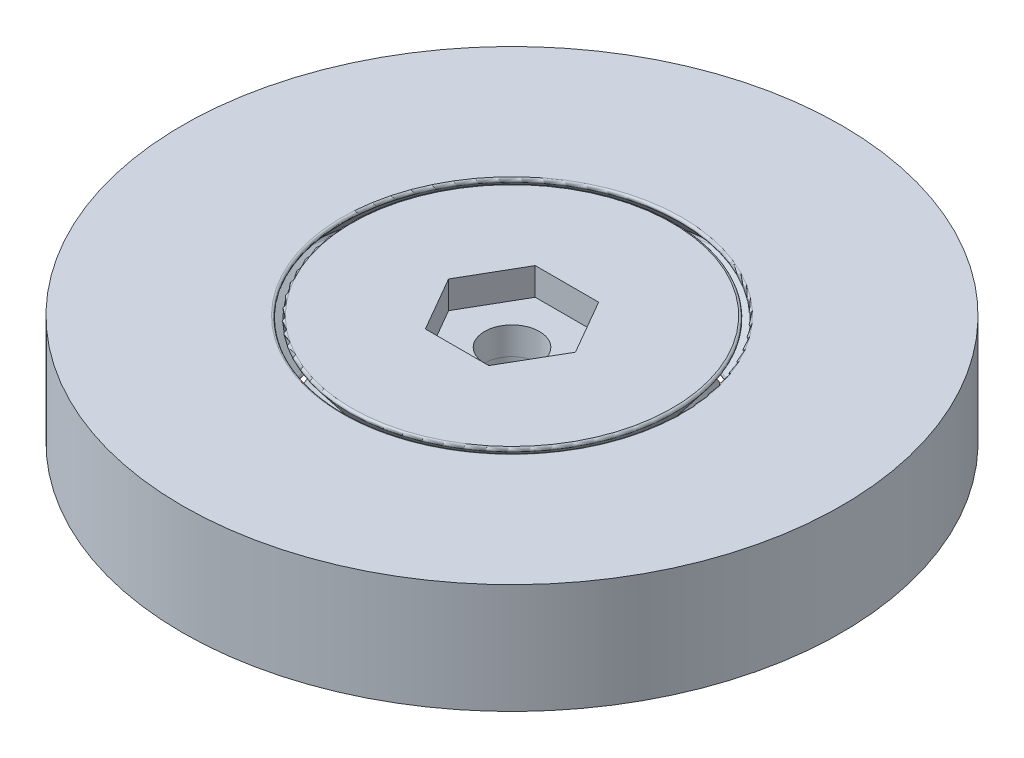
ISO-10303-21;
HEADER;
FILE_DESCRIPTION(('STEP AP214'),'2;1');
FILE_NAME('part.step','',(''),(''),'','','');
FILE_SCHEMA(('AUTOMOTIVE_DESIGN { 1 0 10303 214 1 1 1 1 }'));
ENDSEC;
DATA;
#1=APPLICATION_CONTEXT('core data for automotive mechanical design processes');
#2=APPLICATION_PROTOCOL_DEFINITION('international standard','automotive_design',2000,#1);
#3=PRODUCT_CONTEXT('',#1,'mechanical');
#4=PRODUCT('Part','Part','',(#3));
#5=PRODUCT_RELATED_PRODUCT_CATEGORY('part','',(#4));
#6=PRODUCT_DEFINITION_FORMATION('','',#4);
#7=PRODUCT_DEFINITION_CONTEXT('part definition',#1,'design');
#8=PRODUCT_DEFINITION('design','',#6,#7);
#9=PRODUCT_DEFINITION_SHAPE('','',#8);
#10=(LENGTH_UNIT() NAMED_UNIT(*) SI_UNIT(.MILLI.,.METRE.));
#11=(NAMED_UNIT(*) PLANE_ANGLE_UNIT() SI_UNIT($,.RADIAN.));
#12=(NAMED_UNIT(*) SI_UNIT($,.STERADIAN.) SOLID_ANGLE_UNIT());
#13=UNCERTAINTY_MEASURE_WITH_UNIT(LENGTH_MEASURE(1.E-05),#10,'distance_accuracy_value','');
#14=(GEOMETRIC_REPRESENTATION_CONTEXT(3) GLOBAL_UNCERTAINTY_ASSIGNED_CONTEXT((#13)) GLOBAL_UNIT_ASSIGNED_CONTEXT((#10,
#11,#12)) REPRESENTATION_CONTEXT('',''));
#15=CARTESIAN_POINT('',(0.,0.,0.));
#16=DIRECTION('',(0.,0.,1.));
#17=DIRECTION('',(1.,0.,0.));
#18=AXIS2_PLACEMENT_3D('',#15,#16,#17);
#19=CARTESIAN_POINT('',(7.44133369159931,8.48521483256813,0.));
#20=DIRECTION('',(0.659345815100071,0.751839807478975,0.));
#21=DIRECTION('',(-0.751839807478975,0.659345815100071,0.));
#22=AXIS2_PLACEMENT_3D('',#19,#20,#21);
#23=PLANE('',#22);
#24=CARTESIAN_POINT('',(13.6269144834187,3.0606060682024,0.));
#25=DIRECTION('',(0.659345815100071,0.751839807478975,0.));
#26=DIRECTION('',(-0.751839807478975,0.659345815100071,0.));
#27=AXIS2_PLACEMENT_3D('',#24,#25,#26);
#28=CIRCLE('',#27,2.75407068788538);
#29=CARTESIAN_POINT('',(11.5562945076555,4.87649105074939,0.));
#30=VERTEX_POINT('',#29);
#31=EDGE_CURVE('E11',#30,#30,#28,.F.);
#32=ORIENTED_EDGE('',*,*,#31,.T.);
#33=EDGE_LOOP('',(#32));
#34=FACE_BOUND('',#33,.T.);
#35=ADVANCED_FACE('F47',(#34),#23,.F.);
#36=CARTESIAN_POINT('',(11.050388066125,12.6005526173582,0.));
#37=DIRECTION('',(-0.659345815100071,-0.751839807478975,0.));
#38=DIRECTION('',(0.751839807478975,-0.659345815100071,0.));
#39=AXIS2_PLACEMENT_3D('',#36,#37,#38);
#40=PLANE('',#39);
#41=CARTESIAN_POINT('',(17.2359688579444,7.17594385299252,0.));
#42=DIRECTION('',(-0.659345815100071,-0.751839807478975,0.));
#43=DIRECTION('',(0.751839807478975,-0.659345815100071,0.));
#44=AXIS2_PLACEMENT_3D('',#41,#42,#43);
#45=CIRCLE('',#44,3.08661787785407);
#46=CARTESIAN_POINT('',(19.5566110489914,5.14079527241637,0.));
#47=VERTEX_POINT('',#46);
#48=EDGE_CURVE('E62',#47,#47,#45,.F.);
#49=ORIENTED_EDGE('',*,*,#48,.T.);
#50=EDGE_LOOP('',(#49));
#51=FACE_BOUND('',#50,.T.);
#52=ADVANCED_FACE('F68',(#51),#40,.F.);
#53=CARTESIAN_POINT('',(13.6269144834187,3.0606060682024,0.));
#54=DIRECTION('',(0.659345815100071,0.751839807478975,0.));
#55=DIRECTION('',(-0.751839807478975,0.659345815100071,0.));
#56=AXIS2_PLACEMENT_3D('',#53,#54,#55);
#57=CONICAL_SURFACE('',#56,2.94139112948379,0.0654498469497887);
#58=CARTESIAN_POINT('',(17.0954750390139,7.01574135627894,0.));
#59=DIRECTION('',(-0.659345815100071,-0.751839807478975,0.));
#60=DIRECTION('',(0.751839807478975,-0.659345815100071,0.));
#61=AXIS2_PLACEMENT_3D('',#58,#59,#60);
#62=CIRCLE('',#61,3.28618966250179);
#63=CARTESIAN_POINT('',(14.6247868358192,9.18247675787461,0.));
#64=VERTEX_POINT('',#63);
#65=EDGE_CURVE('E54',#64,#64,#62,.T.);
#66=CARTESIAN_POINT('',(13.7501589905282,3.20113949448041,0.));
#67=DIRECTION('',(-0.659345815100071,-0.751839807478975,0.));
#68=DIRECTION('',(0.751839807478975,-0.659345815100071,0.));
#69=AXIS2_PLACEMENT_3D('',#66,#67,#68);
#70=CIRCLE('',#69,2.9536424725331);
#71=CARTESIAN_POINT('',(11.5294930026172,5.14861129804693,0.));
#72=VERTEX_POINT('',#71);
#73=EDGE_CURVE('E58',#72,#72,#70,.F.);
#74=CARTESIAN_POINT('',(14.6247868358192,9.18247675787461,0.));
#75=CARTESIAN_POINT('',(14.5925441917233,9.1404573260014,0.));
#76=CARTESIAN_POINT('',(14.5603015476275,9.0984378941282,0.));
#77=CARTESIAN_POINT('',(14.4958162594358,9.01439903038179,0.));
#78=CARTESIAN_POINT('',(14.4635736153399,8.97237959850858,0.));
#79=CARTESIAN_POINT('',(14.3990883271482,8.88834073476217,0.));
#80=CARTESIAN_POINT('',(14.3668456830523,8.84632130288897,0.));
#81=CARTESIAN_POINT('',(14.3023603948606,8.76228243914256,0.));
#82=CARTESIAN_POINT('',(14.2701177507648,8.72026300726935,0.));
#83=CARTESIAN_POINT('',(14.2056324625731,8.63622414352294,0.));
#84=CARTESIAN_POINT('',(14.1733898184772,8.59420471164974,0.));
#85=CARTESIAN_POINT('',(14.1089045302855,8.51016584790333,0.));
#86=CARTESIAN_POINT('',(14.0766618861897,8.46814641603012,0.));
#87=CARTESIAN_POINT('',(14.012176597998,8.38410755228371,0.));
#88=CARTESIAN_POINT('',(13.9799339539021,8.34208812041051,0.));
#89=CARTESIAN_POINT('',(13.9154486657104,8.2580492566641,0.));
#90=CARTESIAN_POINT('',(13.8832060216145,8.21602982479089,0.));
#91=CARTESIAN_POINT('',(13.8187207334228,8.13199096104448,0.));
#92=CARTESIAN_POINT('',(13.786478089327,8.08997152917128,0.));
#93=CARTESIAN_POINT('',(13.7219928011353,8.00593266542487,0.));
#94=CARTESIAN_POINT('',(13.6897501570394,7.96391323355166,0.));
#95=CARTESIAN_POINT('',(13.6252648688477,7.87987436980525,0.));
#96=CARTESIAN_POINT('',(13.5930222247519,7.83785493793205,0.));
#97=CARTESIAN_POINT('',(13.5285369365602,7.75381607418564,0.));
#98=CARTESIAN_POINT('',(13.4962942924643,7.71179664231243,0.));
#99=CARTESIAN_POINT('',(13.4318090042726,7.62775777856602,0.));
#100=CARTESIAN_POINT('',(13.3995663601767,7.58573834669282,0.));
#101=CARTESIAN_POINT('',(13.335081071985,7.50169948294641,0.));
#102=CARTESIAN_POINT('',(13.3028384278892,7.4596800510732,0.));
#103=CARTESIAN_POINT('',(13.2383531396975,7.37564118732679,0.));
#104=CARTESIAN_POINT('',(13.2061104956016,7.33362175545359,0.));
#105=CARTESIAN_POINT('',(13.1416252074099,7.24958289170718,0.));
#106=CARTESIAN_POINT('',(13.1093825633141,7.20756345983397,0.));
#107=CARTESIAN_POINT('',(13.0448972751223,7.12352459608756,0.));
#108=CARTESIAN_POINT('',(13.0126546310265,7.08150516421436,0.));
#109=CARTESIAN_POINT('',(12.9481693428348,6.99746630046795,0.));
#110=CARTESIAN_POINT('',(12.9159266987389,6.95544686859474,0.));
#111=CARTESIAN_POINT('',(12.8514414105472,6.87140800484833,0.));
#112=CARTESIAN_POINT('',(12.8191987664514,6.82938857297513,0.));
#113=CARTESIAN_POINT('',(12.7547134782597,6.74534970922872,0.));
#114=CARTESIAN_POINT('',(12.7224708341638,6.70333027735551,0.));
#115=CARTESIAN_POINT('',(12.6579855459721,6.6192914136091,0.));
#116=CARTESIAN_POINT('',(12.6257429018763,6.5772719817359,0.));
#117=CARTESIAN_POINT('',(12.5612576136845,6.49323311798949,0.));
#118=CARTESIAN_POINT('',(12.5290149695887,6.45121368611628,0.));
#119=CARTESIAN_POINT('',(12.464529681397,6.36717482236987,0.));
#120=CARTESIAN_POINT('',(12.4322870373011,6.32515539049667,0.));
#121=CARTESIAN_POINT('',(12.3678017491094,6.24111652675026,0.));
#122=CARTESIAN_POINT('',(12.3355591050136,6.19909709487705,0.));
#123=CARTESIAN_POINT('',(12.2710738168219,6.11505823113065,0.));
#124=CARTESIAN_POINT('',(12.238831172726,6.07303879925744,0.));
#125=CARTESIAN_POINT('',(12.1743458845343,5.98899993551103,0.));
#126=CARTESIAN_POINT('',(12.1421032404384,5.94698050363783,0.));
#127=CARTESIAN_POINT('',(12.0776179522467,5.86294163989141,0.));
#128=CARTESIAN_POINT('',(12.0453753081509,5.82092220801821,0.));
#129=CARTESIAN_POINT('',(11.9808900199592,5.7368833442718,0.));
#130=CARTESIAN_POINT('',(11.9486473758633,5.6948639123986,0.));
#131=CARTESIAN_POINT('',(11.8841620876716,5.61082504865219,0.));
#132=CARTESIAN_POINT('',(11.8519194435758,5.56880561677898,0.));
#133=CARTESIAN_POINT('',(11.7874341553841,5.48476675303257,0.));
#134=CARTESIAN_POINT('',(11.7551915112882,5.44274732115936,0.));
#135=CARTESIAN_POINT('',(11.6907062230965,5.35870845741295,0.));
#136=CARTESIAN_POINT('',(11.6584635790006,5.31668902553975,0.));
#137=CARTESIAN_POINT('',(11.5939782908089,5.23265016179334,0.));
#138=CARTESIAN_POINT('',(11.5617356467131,5.19063072992014,0.));
#139=CARTESIAN_POINT('',(11.5294930026172,5.14861129804693,0.));
#140=B_SPLINE_CURVE_WITH_KNOTS('',3,(#74,#75,#76,#77,#78,#79,#80,#81,#82,#83,#84,#85,#86,#87,
#88,#89,#90,#91,#92,#93,#94,#95,#96,#97,#98,#99,#100,#101,#102,#103,#104,#105,#106,#107,#108,
#109,#110,#111,#112,#113,#114,#115,#116,#117,#118,#119,#120,#121,#122,#123,#124,#125,#126,#127,
#128,#129,#130,#131,#132,#133,#134,#135,#136,#137,#138,#139),.UNSPECIFIED.,.F.,.F.,(4,2,2,2,2,2,
2,2,2,2,2,2,2,2,2,2,2,2,2,2,2,2,2,2,2,2,2,2,2,2,2,2,4),(0.,0.158893004185675,0.31778600837135,
0.476679012557027,0.635572016742701,0.794465020928377,0.953358025114055,1.11225102929973,
1.27114403348541,1.43003703767108,1.58893004185676,1.74782304604243,1.90671605022811,
2.06560905441378,2.22450205859946,2.38339506278513,2.54228806697081,2.70118107115649,
2.86007407534216,3.01896707952784,3.17786008371351,3.33675308789919,3.49564609208487,
3.65453909627054,3.81343210045622,3.97232510464189,4.13121810882757,4.29011111301324,
4.44900411719892,4.6078971213846,4.76679012557027,4.92568312975595,5.08457613394162),.UNSPECIFIED.);
#141=EDGE_CURVE('BSEAM72',#64,#72,#140,.T.);
#142=ORIENTED_EDGE('',*,*,#65,.T.);
#143=ORIENTED_EDGE('',*,*,#73,.T.);
#144=ORIENTED_EDGE('',*,*,#141,.T.);
#145=ORIENTED_EDGE('',*,*,#141,.F.);
#146=EDGE_LOOP('',(#142,#144,#143,#145));
#147=FACE_BOUND('',#146,.T.);
#148=ADVANCED_FACE('F72',(#147),#57,.T.);
#149=CARTESIAN_POINT('',(17.1040996949244,7.02557589149672,0.));
#150=DIRECTION('',(-0.659345815100071,-0.751839807478975,0.));
#151=DIRECTION('',(0.751839807478975,-0.659345815100071,0.));
#152=AXIS2_PLACEMENT_3D('',#149,#150,#151);
#153=TOROIDAL_SURFACE('',#152,3.08661787785407,0.2);
#154=ORIENTED_EDGE('',*,*,#65,.F.);
#155=EDGE_LOOP('',(#154));
#156=FACE_BOUND('',#155,.T.);
#157=ORIENTED_EDGE('',*,*,#48,.F.);
#158=EDGE_LOOP('',(#157));
#159=FACE_BOUND('',#158,.T.);
#160=ADVANCED_FACE('F70',(#156,#159),#153,.T.);
#161=CARTESIAN_POINT('',(13.7587836464387,3.21097402969819,0.));
#162=DIRECTION('',(0.659345815100071,0.751839807478975,0.));
#163=DIRECTION('',(-0.751839807478975,0.659345815100071,0.));
#164=AXIS2_PLACEMENT_3D('',#161,#162,#163);
#165=TOROIDAL_SURFACE('',#164,2.75407068788538,0.2);
#166=ORIENTED_EDGE('',*,*,#31,.F.);
#167=EDGE_LOOP('',(#166));
#168=FACE_BOUND('',#167,.T.);
#169=ORIENTED_EDGE('',*,*,#73,.F.);
#170=EDGE_LOOP('',(#169));
#171=FACE_BOUND('',#170,.T.);
#172=ADVANCED_FACE('F49',(#168,#171),#165,.T.);
#173=CLOSED_SHELL('',(#35,#52,#148,#160,#172));
#174=MANIFOLD_SOLID_BREP('B2',#173);
#175=CARTESIAN_POINT('',(0.,5.,0.));
#176=DIRECTION('',(0.,-1.,0.));
#177=DIRECTION('',(0.,0.,-1.));
#178=AXIS2_PLACEMENT_3D('',#175,#176,#177);
#179=CONICAL_SURFACE('',#178,20.0000000000001,0.785398163397455);
#180=CARTESIAN_POINT('',(0.,9.65857864376268,0.));
#181=DIRECTION('',(0.,1.,0.));
#182=DIRECTION('',(0.,0.,1.));
#183=AXIS2_PLACEMENT_3D('',#180,#181,#182);
#184=CIRCLE('',#183,15.3414213562373);
#185=CARTESIAN_POINT('',(0.,9.65857864376268,15.3414213562373));
#186=VERTEX_POINT('',#185);
#187=EDGE_CURVE('E142',#186,#186,#184,.T.);
#188=ORIENTED_EDGE('',*,*,#187,.T.);
#189=EDGE_LOOP('',(#188));
#190=FACE_BOUND('',#189,.T.);
#191=CARTESIAN_POINT('',(0.,5.14142135623731,0.));
#192=DIRECTION('',(0.,1.,0.));
#193=DIRECTION('',(0.,0.,1.));
#194=AXIS2_PLACEMENT_3D('',#191,#192,#193);
#195=CIRCLE('',#194,19.8585786437627);
#196=CARTESIAN_POINT('',(0.,5.14142135623731,19.8585786437627));
#197=VERTEX_POINT('',#196);
#198=EDGE_CURVE('E147',#197,#197,#195,.F.);
#199=ORIENTED_EDGE('',*,*,#198,.T.);
#200=EDGE_LOOP('',(#199));
#201=FACE_BOUND('',#200,.T.);
#202=ADVANCED_FACE('F127',(#190,#201),#179,.F.);
#203=CARTESIAN_POINT('',(0.,5.,0.));
#204=DIRECTION('',(0.,1.,0.));
#205=DIRECTION('',(0.,0.,1.));
#206=AXIS2_PLACEMENT_3D('',#203,#204,#205);
#207=CONICAL_SURFACE('',#206,20.0000000000001,0.785398163397453);
#208=CARTESIAN_POINT('',(0.,4.85857864376269,0.));
#209=DIRECTION('',(0.,-1.,0.));
#210=DIRECTION('',(0.,0.,-1.));
#211=AXIS2_PLACEMENT_3D('',#208,#209,#210);
#212=CIRCLE('',#211,19.8585786437627);
#213=CARTESIAN_POINT('',(0.,4.85857864376269,-19.8585786437627));
#214=VERTEX_POINT('',#213);
#215=EDGE_CURVE('E134',#214,#214,#212,.F.);
#216=ORIENTED_EDGE('',*,*,#215,.T.);
#217=EDGE_LOOP('',(#216));
#218=FACE_BOUND('',#217,.T.);
#219=CARTESIAN_POINT('',(0.,0.34142135623731,0.));
#220=DIRECTION('',(0.,-1.,0.));
#221=DIRECTION('',(0.,0.,-1.));
#222=AXIS2_PLACEMENT_3D('',#219,#220,#221);
#223=CIRCLE('',#222,15.3414213562373);
#224=CARTESIAN_POINT('',(0.,0.34142135623731,-15.3414213562373));
#225=VERTEX_POINT('',#224);
#226=EDGE_CURVE('E138',#225,#225,#223,.T.);
#227=ORIENTED_EDGE('',*,*,#226,.T.);
#228=EDGE_LOOP('',(#227));
#229=FACE_BOUND('',#228,.T.);
#230=ADVANCED_FACE('F178',(#218,#229),#207,.F.);
#231=CARTESIAN_POINT('',(0.,0.,0.));
#232=DIRECTION('',(0.,-1.,0.));
#233=DIRECTION('',(0.,0.,-1.));
#234=AXIS2_PLACEMENT_3D('',#231,#232,#233);
#235=PLANE('',#234);
#236=CARTESIAN_POINT('',(0.,0.,0.));
#237=DIRECTION('',(0.,-1.,0.));
#238=DIRECTION('',(0.,0.,-1.));
#239=AXIS2_PLACEMENT_3D('',#236,#237,#238);
#240=CIRCLE('',#239,15.4828427124746);
#241=CARTESIAN_POINT('',(0.,0.,-15.4828427124746));
#242=VERTEX_POINT('',#241);
#243=EDGE_CURVE('E46',#242,#242,#240,.F.);
#244=ORIENTED_EDGE('',*,*,#243,.T.);
#245=EDGE_LOOP('',(#244));
#246=FACE_BOUND('',#245,.T.);
#247=CARTESIAN_POINT('',(0.,0.,0.));
#248=DIRECTION('',(0.,-1.,0.));
#249=DIRECTION('',(0.,0.,-1.));
#250=AXIS2_PLACEMENT_3D('',#247,#248,#249);
#251=CIRCLE('',#250,30.);
#252=CARTESIAN_POINT('',(0.,0.,-30.));
#253=VERTEX_POINT('',#252);
#254=EDGE_CURVE('E153',#253,#253,#251,.T.);
#255=ORIENTED_EDGE('',*,*,#254,.T.);
#256=EDGE_LOOP('',(#255));
#257=FACE_BOUND('',#256,.T.);
#258=ADVANCED_FACE('F175',(#246,#257),#235,.T.);
#259=CARTESIAN_POINT('',(0.,0.,0.));
#260=DIRECTION('',(0.,-1.,0.));
#261=DIRECTION('',(0.,0.,-1.));
#262=AXIS2_PLACEMENT_3D('',#259,#260,#261);
#263=CYLINDRICAL_SURFACE('',#262,30.);
#264=CARTESIAN_POINT('',(0.,10.,0.));
#265=DIRECTION('',(0.,-1.,0.));
#266=DIRECTION('',(0.,0.,-1.));
#267=AXIS2_PLACEMENT_3D('',#264,#265,#266);
#268=CIRCLE('',#267,30.);
#269=CARTESIAN_POINT('',(0.,10.,-30.));
#270=VERTEX_POINT('',#269);
#271=EDGE_CURVE('E156',#270,#270,#268,.T.);
#272=ORIENTED_EDGE('',*,*,#271,.T.);
#273=EDGE_LOOP('',(#272));
#274=FACE_BOUND('',#273,.T.);
#275=ORIENTED_EDGE('',*,*,#254,.F.);
#276=EDGE_LOOP('',(#275));
#277=FACE_BOUND('',#276,.T.);
#278=ADVANCED_FACE('F160',(#274,#277),#263,.T.);
#279=CARTESIAN_POINT('',(0.,9.99999999999999,0.));
#280=DIRECTION('',(0.,-1.,0.));
#281=DIRECTION('',(0.,0.,-1.));
#282=AXIS2_PLACEMENT_3D('',#279,#280,#281);
#283=PLANE('',#282);
#284=CARTESIAN_POINT('',(0.,9.99999999999999,0.));
#285=DIRECTION('',(0.,-1.,0.));
#286=DIRECTION('',(0.,0.,-1.));
#287=AXIS2_PLACEMENT_3D('',#284,#285,#286);
#288=CIRCLE('',#287,15.4828427124746);
#289=CARTESIAN_POINT('',(0.,9.99999999999999,-15.4828427124746));
#290=VERTEX_POINT('',#289);
#291=EDGE_CURVE('E150',#290,#290,#288,.T.);
#292=ORIENTED_EDGE('',*,*,#291,.T.);
#293=EDGE_LOOP('',(#292));
#294=FACE_BOUND('',#293,.T.);
#295=ORIENTED_EDGE('',*,*,#271,.F.);
#296=EDGE_LOOP('',(#295));
#297=FACE_BOUND('',#296,.T.);
#298=ADVANCED_FACE('F163',(#294,#297),#283,.F.);
#299=CARTESIAN_POINT('',(0.,9.79999999999999,0.));
#300=DIRECTION('',(0.,-1.,0.));
#301=DIRECTION('',(0.,0.,-1.));
#302=AXIS2_PLACEMENT_3D('',#299,#300,#301);
#303=TOROIDAL_SURFACE('',#302,15.4828427124746,0.2);
#304=ORIENTED_EDGE('',*,*,#187,.F.);
#305=EDGE_LOOP('',(#304));
#306=FACE_BOUND('',#305,.T.);
#307=ORIENTED_EDGE('',*,*,#291,.F.);
#308=EDGE_LOOP('',(#307));
#309=FACE_BOUND('',#308,.T.);
#310=ADVANCED_FACE('F165',(#306,#309),#303,.T.);
#311=CARTESIAN_POINT('',(0.,5.,0.));
#312=DIRECTION('',(0.,-1.,0.));
#313=DIRECTION('',(0.,0.,-1.));
#314=AXIS2_PLACEMENT_3D('',#311,#312,#313);
#315=TOROIDAL_SURFACE('',#314,19.7171572875254,0.2);
#316=ORIENTED_EDGE('',*,*,#215,.F.);
#317=EDGE_LOOP('',(#316));
#318=FACE_BOUND('',#317,.T.);
#319=ORIENTED_EDGE('',*,*,#198,.F.);
#320=EDGE_LOOP('',(#319));
#321=FACE_BOUND('',#320,.T.);
#322=ADVANCED_FACE('F172',(#318,#321),#315,.F.);
#323=CARTESIAN_POINT('',(0.,0.2,0.));
#324=DIRECTION('',(0.,-1.,0.));
#325=DIRECTION('',(0.,0.,-1.));
#326=AXIS2_PLACEMENT_3D('',#323,#324,#325);
#327=TOROIDAL_SURFACE('',#326,15.4828427124746,0.2);
#328=ORIENTED_EDGE('',*,*,#243,.F.);
#329=EDGE_LOOP('',(#328));
#330=FACE_BOUND('',#329,.T.);
#331=ORIENTED_EDGE('',*,*,#226,.F.);
#332=EDGE_LOOP('',(#331));
#333=FACE_BOUND('',#332,.T.);
#334=ADVANCED_FACE('F129',(#330,#333),#327,.T.);
#335=CLOSED_SHELL('',(#202,#230,#258,#278,#298,#310,#322,#334));
#336=MANIFOLD_SOLID_BREP('B6',#335);
#337=CARTESIAN_POINT('',(0.,5.,0.));
#338=DIRECTION('',(0.,1.,0.));
#339=DIRECTION('',(0.,0.,-1.));
#340=AXIS2_PLACEMENT_3D('',#337,#338,#339);
#341=CONICAL_SURFACE('',#340,11.1633650601052,0.654498469497876);
#342=CARTESIAN_POINT('',(0.,5.07824771419825,0.));
#343=DIRECTION('',(0.,-1.,0.));
#344=DIRECTION('',(0.,0.,-1.));
#345=AXIS2_PLACEMENT_3D('',#342,#343,#344);
#346=CIRCLE('',#345,11.2234066429572);
#347=CARTESIAN_POINT('',(0.,5.07824771419825,-11.2234066429572));
#348=VERTEX_POINT('',#347);
#349=EDGE_CURVE('E349',#348,#348,#346,.T.);
#350=ORIENTED_EDGE('',*,*,#349,.F.);
#351=EDGE_LOOP('',(#350));
#352=FACE_BOUND('',#351,.T.);
#353=CARTESIAN_POINT('',(0.,9.67824771419826,0.));
#354=DIRECTION('',(0.,1.,0.));
#355=DIRECTION('',(0.,0.,1.));
#356=AXIS2_PLACEMENT_3D('',#353,#354,#355);
#357=CIRCLE('',#356,14.7531107876604);
#358=CARTESIAN_POINT('',(0.,9.67824771419826,14.7531107876604));
#359=VERTEX_POINT('',#358);
#360=EDGE_CURVE('E346',#359,#359,#357,.T.);
#361=ORIENTED_EDGE('',*,*,#360,.F.);
#362=EDGE_LOOP('',(#361));
#363=FACE_BOUND('',#362,.T.);
#364=ADVANCED_FACE('F257',(#352,#363),#341,.T.);
#365=CARTESIAN_POINT('',(0.,5.,0.));
#366=DIRECTION('',(0.,-1.,0.));
#367=DIRECTION('',(0.,0.,1.));
#368=AXIS2_PLACEMENT_3D('',#365,#366,#367);
#369=PLANE('',#368);
#370=CARTESIAN_POINT('',(0.,5.,0.));
#371=DIRECTION('',(0.,-1.,0.));
#372=DIRECTION('',(0.,0.,-1.));
#373=AXIS2_PLACEMENT_3D('',#370,#371,#372);
#374=CIRCLE('',#373,2.5);
#375=CARTESIAN_POINT('',(0.,5.,-2.5));
#376=VERTEX_POINT('',#375);
#377=EDGE_CURVE('E414',#376,#376,#374,.T.);
#378=ORIENTED_EDGE('',*,*,#377,.F.);
#379=EDGE_LOOP('',(#378));
#380=FACE_BOUND('',#379,.T.);
#381=CARTESIAN_POINT('',(0.,5.,0.));
#382=DIRECTION('',(0.,1.,0.));
#383=DIRECTION('',(0.,0.,1.));
#384=AXIS2_PLACEMENT_3D('',#381,#382,#383);
#385=CIRCLE('',#384,11.0647359748989);
#386=CARTESIAN_POINT('',(0.,5.,11.0647359748989));
#387=VERTEX_POINT('',#386);
#388=EDGE_CURVE('E265',#387,#387,#385,.T.);
#389=ORIENTED_EDGE('',*,*,#388,.F.);
#390=EDGE_LOOP('',(#389));
#391=FACE_BOUND('',#390,.T.);
#392=ADVANCED_FACE('F357',(#380,#391),#369,.T.);
#393=CARTESIAN_POINT('',(0.,10.,0.));
#394=DIRECTION('',(0.,-1.,0.));
#395=DIRECTION('',(0.,0.,1.));
#396=AXIS2_PLACEMENT_3D('',#393,#394,#395);
#397=PLANE('',#396);
#398=DIRECTION('',(0.5,0.,-0.866025403784438));
#399=VECTOR('',#398,1.);
#400=CARTESIAN_POINT('',(-5.77350269189626,10.,0.));
#401=LINE('',#400,#399);
#402=CARTESIAN_POINT('',(-5.77350269189626,10.,0.));
#403=VERTEX_POINT('',#402);
#404=CARTESIAN_POINT('',(-2.88675134594813,10.,-5.));
#405=VERTEX_POINT('',#404);
#406=EDGE_CURVE('E429',#403,#405,#401,.T.);
#407=ORIENTED_EDGE('',*,*,#406,.T.);
#408=DIRECTION('',(1.,0.,0.));
#409=VECTOR('',#408,1.);
#410=CARTESIAN_POINT('',(-2.88675134594813,10.,-5.));
#411=LINE('',#410,#409);
#412=CARTESIAN_POINT('',(2.88675134594813,10.,-5.));
#413=VERTEX_POINT('',#412);
#414=EDGE_CURVE('E432',#405,#413,#411,.T.);
#415=ORIENTED_EDGE('',*,*,#414,.T.);
#416=DIRECTION('',(0.5,0.,0.866025403784439));
#417=VECTOR('',#416,1.);
#418=CARTESIAN_POINT('',(2.88675134594813,10.,-5.));
#419=LINE('',#418,#417);
#420=CARTESIAN_POINT('',(5.77350269189626,10.,0.));
#421=VERTEX_POINT('',#420);
#422=EDGE_CURVE('E435',#413,#421,#419,.T.);
#423=ORIENTED_EDGE('',*,*,#422,.T.);
#424=DIRECTION('',(-0.5,0.,0.866025403784439));
#425=VECTOR('',#424,1.);
#426=CARTESIAN_POINT('',(5.77350269189626,10.,0.));
#427=LINE('',#426,#425);
#428=CARTESIAN_POINT('',(2.88675134594813,10.,5.));
#429=VERTEX_POINT('',#428);
#430=EDGE_CURVE('E335',#421,#429,#427,.T.);
#431=ORIENTED_EDGE('',*,*,#430,.T.);
#432=DIRECTION('',(-1.,0.,0.));
#433=VECTOR('',#432,1.);
#434=CARTESIAN_POINT('',(2.88675134594813,10.,5.));
#435=LINE('',#434,#433);
#436=CARTESIAN_POINT('',(-2.88675134594813,10.,5.));
#437=VERTEX_POINT('',#436);
#438=EDGE_CURVE('E424',#429,#437,#435,.T.);
#439=ORIENTED_EDGE('',*,*,#438,.T.);
#440=DIRECTION('',(-0.5,0.,-0.866025403784439));
#441=VECTOR('',#440,1.);
#442=CARTESIAN_POINT('',(-2.88675134594813,10.,5.));
#443=LINE('',#442,#441);
#444=EDGE_CURVE('E419',#437,#403,#443,.T.);
#445=ORIENTED_EDGE('',*,*,#444,.T.);
#446=EDGE_LOOP('',(#407,#415,#423,#431,#439,#445));
#447=FACE_BOUND('',#446,.T.);
#448=CARTESIAN_POINT('',(0.,10.,0.));
#449=DIRECTION('',(0.,1.,0.));
#450=DIRECTION('',(0.,0.,1.));
#451=AXIS2_PLACEMENT_3D('',#448,#449,#450);
#452=CIRCLE('',#451,14.5944401196022);
#453=CARTESIAN_POINT('',(0.,10.,14.5944401196022));
#454=VERTEX_POINT('',#453);
#455=EDGE_CURVE('E125',#454,#454,#452,.F.);
#456=ORIENTED_EDGE('',*,*,#455,.F.);
#457=EDGE_LOOP('',(#456));
#458=FACE_BOUND('',#457,.T.);
#459=ADVANCED_FACE('F359',(#447,#458),#397,.F.);
#460=CARTESIAN_POINT('',(0.,5.2,0.));
#461=DIRECTION('',(0.,-1.,0.));
#462=DIRECTION('',(0.,0.,1.));
#463=AXIS2_PLACEMENT_3D('',#460,#461,#462);
#464=TOROIDAL_SURFACE('',#463,11.0647359748989,0.2);
#465=ORIENTED_EDGE('',*,*,#388,.T.);
#466=EDGE_LOOP('',(#465));
#467=FACE_BOUND('',#466,.T.);
#468=ORIENTED_EDGE('',*,*,#349,.T.);
#469=EDGE_LOOP('',(#468));
#470=FACE_BOUND('',#469,.T.);
#471=ADVANCED_FACE('F354',(#467,#470),#464,.T.);
#472=CARTESIAN_POINT('',(0.,9.8,0.));
#473=DIRECTION('',(0.,-1.,0.));
#474=DIRECTION('',(0.,0.,1.));
#475=AXIS2_PLACEMENT_3D('',#472,#473,#474);
#476=TOROIDAL_SURFACE('',#475,14.5944401196022,0.2);
#477=ORIENTED_EDGE('',*,*,#360,.T.);
#478=EDGE_LOOP('',(#477));
#479=FACE_BOUND('',#478,.T.);
#480=ORIENTED_EDGE('',*,*,#455,.T.);
#481=EDGE_LOOP('',(#480));
#482=FACE_BOUND('',#481,.T.);
#483=ADVANCED_FACE('F259',(#479,#482),#476,.T.);
#484=CARTESIAN_POINT('',(-2.88675134594813,7.5,5.));
#485=DIRECTION('',(-0.866025403784439,0.,0.5));
#486=DIRECTION('',(0.5,0.,0.866025403784439));
#487=AXIS2_PLACEMENT_3D('',#484,#485,#486);
#488=PLANE('',#487);
#489=ORIENTED_EDGE('',*,*,#444,.F.);
#490=DIRECTION('',(0.,1.,0.));
#491=VECTOR('',#490,1.);
#492=CARTESIAN_POINT('',(-2.88675134594813,7.5,5.));
#493=LINE('',#492,#491);
#494=CARTESIAN_POINT('',(-2.88675134594813,7.5,5.));
#495=VERTEX_POINT('',#494);
#496=EDGE_CURVE('E303',#495,#437,#493,.T.);
#497=ORIENTED_EDGE('',*,*,#496,.F.);
#498=DIRECTION('',(-0.5,0.,-0.866025403784439));
#499=VECTOR('',#498,1.);
#500=CARTESIAN_POINT('',(-2.88675134594813,7.5,5.));
#501=LINE('',#500,#499);
#502=CARTESIAN_POINT('',(-5.77350269189626,7.5,0.));
#503=VERTEX_POINT('',#502);
#504=EDGE_CURVE('E422',#495,#503,#501,.T.);
#505=ORIENTED_EDGE('',*,*,#504,.T.);
#506=DIRECTION('',(0.,1.,0.));
#507=VECTOR('',#506,1.);
#508=CARTESIAN_POINT('',(-5.77350269189626,7.5,0.));
#509=LINE('',#508,#507);
#510=EDGE_CURVE('E272',#503,#403,#509,.T.);
#511=ORIENTED_EDGE('',*,*,#510,.T.);
#512=EDGE_LOOP('',(#489,#497,#505,#511));
#513=FACE_BOUND('',#512,.T.);
#514=ADVANCED_FACE('F376',(#513),#488,.F.);
#515=CARTESIAN_POINT('',(2.88675134594813,7.5,5.));
#516=DIRECTION('',(0.,0.,1.));
#517=DIRECTION('',(1.,0.,0.));
#518=AXIS2_PLACEMENT_3D('',#515,#516,#517);
#519=PLANE('',#518);
#520=ORIENTED_EDGE('',*,*,#438,.F.);
#521=DIRECTION('',(0.,1.,0.));
#522=VECTOR('',#521,1.);
#523=CARTESIAN_POINT('',(2.88675134594813,7.5,5.));
#524=LINE('',#523,#522);
#525=CARTESIAN_POINT('',(2.88675134594813,7.5,5.));
#526=VERTEX_POINT('',#525);
#527=EDGE_CURVE('E337',#526,#429,#524,.T.);
#528=ORIENTED_EDGE('',*,*,#527,.F.);
#529=DIRECTION('',(-1.,0.,0.));
#530=VECTOR('',#529,1.);
#531=CARTESIAN_POINT('',(2.88675134594813,7.5,5.));
#532=LINE('',#531,#530);
#533=EDGE_CURVE('E281',#526,#495,#532,.T.);
#534=ORIENTED_EDGE('',*,*,#533,.T.);
#535=ORIENTED_EDGE('',*,*,#496,.T.);
#536=EDGE_LOOP('',(#520,#528,#534,#535));
#537=FACE_BOUND('',#536,.T.);
#538=ADVANCED_FACE('F381',(#537),#519,.F.);
#539=CARTESIAN_POINT('',(5.77350269189626,7.5,0.));
#540=DIRECTION('',(0.866025403784439,0.,0.5));
#541=DIRECTION('',(0.5,0.,-0.866025403784439));
#542=AXIS2_PLACEMENT_3D('',#539,#540,#541);
#543=PLANE('',#542);
#544=ORIENTED_EDGE('',*,*,#430,.F.);
#545=DIRECTION('',(0.,1.,0.));
#546=VECTOR('',#545,1.);
#547=CARTESIAN_POINT('',(5.77350269189626,7.5,0.));
#548=LINE('',#547,#546);
#549=CARTESIAN_POINT('',(5.77350269189626,7.5,0.));
#550=VERTEX_POINT('',#549);
#551=EDGE_CURVE('E324',#550,#421,#548,.T.);
#552=ORIENTED_EDGE('',*,*,#551,.F.);
#553=DIRECTION('',(-0.5,0.,0.866025403784439));
#554=VECTOR('',#553,1.);
#555=CARTESIAN_POINT('',(5.77350269189626,7.5,0.));
#556=LINE('',#555,#554);
#557=EDGE_CURVE('E327',#550,#526,#556,.T.);
#558=ORIENTED_EDGE('',*,*,#557,.T.);
#559=ORIENTED_EDGE('',*,*,#527,.T.);
#560=EDGE_LOOP('',(#544,#552,#558,#559));
#561=FACE_BOUND('',#560,.T.);
#562=ADVANCED_FACE('F333',(#561),#543,.F.);
#563=CARTESIAN_POINT('',(2.88675134594813,7.5,-5.));
#564=DIRECTION('',(0.866025403784439,0.,-0.5));
#565=DIRECTION('',(-0.5,0.,-0.866025403784439));
#566=AXIS2_PLACEMENT_3D('',#563,#564,#565);
#567=PLANE('',#566);
#568=ORIENTED_EDGE('',*,*,#422,.F.);
#569=DIRECTION('',(0.,1.,0.));
#570=VECTOR('',#569,1.);
#571=CARTESIAN_POINT('',(2.88675134594813,7.5,-5.));
#572=LINE('',#571,#570);
#573=CARTESIAN_POINT('',(2.88675134594813,7.5,-5.));
#574=VERTEX_POINT('',#573);
#575=EDGE_CURVE('E326',#574,#413,#572,.T.);
#576=ORIENTED_EDGE('',*,*,#575,.F.);
#577=DIRECTION('',(0.5,0.,0.866025403784439));
#578=VECTOR('',#577,1.);
#579=CARTESIAN_POINT('',(2.88675134594813,7.5,-5.));
#580=LINE('',#579,#578);
#581=EDGE_CURVE('E319',#574,#550,#580,.T.);
#582=ORIENTED_EDGE('',*,*,#581,.T.);
#583=ORIENTED_EDGE('',*,*,#551,.T.);
#584=EDGE_LOOP('',(#568,#576,#582,#583));
#585=FACE_BOUND('',#584,.T.);
#586=ADVANCED_FACE('F322',(#585),#567,.F.);
#587=CARTESIAN_POINT('',(-2.88675134594813,7.5,-5.));
#588=DIRECTION('',(0.,0.,-1.));
#589=DIRECTION('',(-1.,0.,0.));
#590=AXIS2_PLACEMENT_3D('',#587,#588,#589);
#591=PLANE('',#590);
#592=ORIENTED_EDGE('',*,*,#414,.F.);
#593=DIRECTION('',(0.,1.,0.));
#594=VECTOR('',#593,1.);
#595=CARTESIAN_POINT('',(-2.88675134594813,7.5,-5.));
#596=LINE('',#595,#594);
#597=CARTESIAN_POINT('',(-2.88675134594813,7.5,-5.));
#598=VERTEX_POINT('',#597);
#599=EDGE_CURVE('E340',#598,#405,#596,.T.);
#600=ORIENTED_EDGE('',*,*,#599,.F.);
#601=DIRECTION('',(1.,0.,0.));
#602=VECTOR('',#601,1.);
#603=CARTESIAN_POINT('',(-2.88675134594813,7.5,-5.));
#604=LINE('',#603,#602);
#605=EDGE_CURVE('E328',#598,#574,#604,.T.);
#606=ORIENTED_EDGE('',*,*,#605,.T.);
#607=ORIENTED_EDGE('',*,*,#575,.T.);
#608=EDGE_LOOP('',(#592,#600,#606,#607));
#609=FACE_BOUND('',#608,.T.);
#610=ADVANCED_FACE('F395',(#609),#591,.F.);
#611=CARTESIAN_POINT('',(-5.77350269189626,7.5,0.));
#612=DIRECTION('',(-0.866025403784439,0.,-0.5));
#613=DIRECTION('',(-0.5,0.,0.866025403784439));
#614=AXIS2_PLACEMENT_3D('',#611,#612,#613);
#615=PLANE('',#614);
#616=ORIENTED_EDGE('',*,*,#406,.F.);
#617=ORIENTED_EDGE('',*,*,#510,.F.);
#618=DIRECTION('',(0.5,0.,-0.866025403784438));
#619=VECTOR('',#618,1.);
#620=CARTESIAN_POINT('',(-5.77350269189626,7.5,0.));
#621=LINE('',#620,#619);
#622=EDGE_CURVE('E310',#503,#598,#621,.T.);
#623=ORIENTED_EDGE('',*,*,#622,.T.);
#624=ORIENTED_EDGE('',*,*,#599,.T.);
#625=EDGE_LOOP('',(#616,#617,#623,#624));
#626=FACE_BOUND('',#625,.T.);
#627=ADVANCED_FACE('F392',(#626),#615,.F.);
#628=CARTESIAN_POINT('',(0.,7.5,0.));
#629=DIRECTION('',(0.,1.,0.));
#630=DIRECTION('',(0.,0.,-1.));
#631=AXIS2_PLACEMENT_3D('',#628,#629,#630);
#632=PLANE('',#631);
#633=CARTESIAN_POINT('',(0.,7.5,0.));
#634=DIRECTION('',(0.,-1.,0.));
#635=DIRECTION('',(0.,0.,-1.));
#636=AXIS2_PLACEMENT_3D('',#633,#634,#635);
#637=CIRCLE('',#636,2.49999999999999);
#638=CARTESIAN_POINT('',(0.,7.5,-2.49999999999999));
#639=VERTEX_POINT('',#638);
#640=EDGE_CURVE('E417',#639,#639,#637,.T.);
#641=ORIENTED_EDGE('',*,*,#640,.T.);
#642=EDGE_LOOP('',(#641));
#643=FACE_BOUND('',#642,.T.);
#644=ORIENTED_EDGE('',*,*,#504,.F.);
#645=ORIENTED_EDGE('',*,*,#533,.F.);
#646=ORIENTED_EDGE('',*,*,#557,.F.);
#647=ORIENTED_EDGE('',*,*,#581,.F.);
#648=ORIENTED_EDGE('',*,*,#605,.F.);
#649=ORIENTED_EDGE('',*,*,#622,.F.);
#650=EDGE_LOOP('',(#644,#645,#646,#647,#648,#649));
#651=FACE_BOUND('',#650,.T.);
#652=ADVANCED_FACE('F330',(#643,#651),#632,.T.);
#653=CARTESIAN_POINT('',(0.,7.5,0.));
#654=DIRECTION('',(0.,1.,0.));
#655=DIRECTION('',(0.,0.,-1.));
#656=AXIS2_PLACEMENT_3D('',#653,#654,#655);
#657=CYLINDRICAL_SURFACE('',#656,2.49999999999999);
#658=ORIENTED_EDGE('',*,*,#377,.T.);
#659=EDGE_LOOP('',(#658));
#660=FACE_BOUND('',#659,.T.);
#661=ORIENTED_EDGE('',*,*,#640,.F.);
#662=EDGE_LOOP('',(#661));
#663=FACE_BOUND('',#662,.T.);
#664=ADVANCED_FACE('F406',(#660,#663),#657,.F.);
#665=CLOSED_SHELL('',(#364,#392,#459,#471,#483,#514,#538,#562,#586,#610,#627,#652,#664));
#666=MANIFOLD_SOLID_BREP('B41',#665);
#667=CARTESIAN_POINT('',(0.,5.,0.));
#668=DIRECTION('',(0.,-1.,0.));
#669=DIRECTION('',(0.,0.,-1.));
#670=AXIS2_PLACEMENT_3D('',#667,#668,#669);
#671=CONICAL_SURFACE('',#670,11.1633650601052,0.654498469497876);
#672=CARTESIAN_POINT('',(0.,4.92175228580175,0.));
#673=DIRECTION('',(0.,-1.,0.));
#674=DIRECTION('',(0.,0.,-1.));
#675=AXIS2_PLACEMENT_3D('',#672,#673,#674);
#676=CIRCLE('',#675,11.2234066429572);
#677=CARTESIAN_POINT('',(0.,4.92175228580175,-11.2234066429572));
#678=VERTEX_POINT('',#677);
#679=EDGE_CURVE('E624',#678,#678,#676,.T.);
#680=ORIENTED_EDGE('',*,*,#679,.T.);
#681=EDGE_LOOP('',(#680));
#682=FACE_BOUND('',#681,.T.);
#683=CARTESIAN_POINT('',(0.,0.321752285801745,0.));
#684=DIRECTION('',(0.,1.,0.));
#685=DIRECTION('',(0.,0.,1.));
#686=AXIS2_PLACEMENT_3D('',#683,#684,#685);
#687=CIRCLE('',#686,14.7531107876604);
#688=CARTESIAN_POINT('',(0.,0.321752285801745,14.7531107876604));
#689=VERTEX_POINT('',#688);
#690=EDGE_CURVE('E616',#689,#689,#687,.T.);
#691=ORIENTED_EDGE('',*,*,#690,.T.);
#692=EDGE_LOOP('',(#691));
#693=FACE_BOUND('',#692,.T.);
#694=ADVANCED_FACE('F513',(#682,#693),#671,.T.);
#695=CARTESIAN_POINT('',(0.,5.,0.));
#696=DIRECTION('',(0.,1.,0.));
#697=DIRECTION('',(0.,0.,1.));
#698=AXIS2_PLACEMENT_3D('',#695,#696,#697);
#699=PLANE('',#698);
#700=CARTESIAN_POINT('',(0.,5.,0.));
#701=DIRECTION('',(0.,-1.,0.));
#702=DIRECTION('',(0.,0.,-1.));
#703=AXIS2_PLACEMENT_3D('',#700,#701,#702);
#704=CIRCLE('',#703,2.5);
#705=CARTESIAN_POINT('',(0.,5.,-2.5));
#706=VERTEX_POINT('',#705);
#707=EDGE_CURVE('E603',#706,#706,#704,.T.);
#708=ORIENTED_EDGE('',*,*,#707,.T.);
#709=EDGE_LOOP('',(#708));
#710=FACE_BOUND('',#709,.T.);
#711=CARTESIAN_POINT('',(0.,5.,0.));
#712=DIRECTION('',(0.,1.,0.));
#713=DIRECTION('',(0.,0.,1.));
#714=AXIS2_PLACEMENT_3D('',#711,#712,#713);
#715=CIRCLE('',#714,11.0647359748989);
#716=CARTESIAN_POINT('',(0.,5.,11.0647359748989));
#717=VERTEX_POINT('',#716);
#718=EDGE_CURVE('E521',#717,#717,#715,.T.);
#719=ORIENTED_EDGE('',*,*,#718,.T.);
#720=EDGE_LOOP('',(#719));
#721=FACE_BOUND('',#720,.T.);
#722=ADVANCED_FACE('F629',(#710,#721),#699,.T.);
#723=CARTESIAN_POINT('',(0.,0.,0.));
#724=DIRECTION('',(0.,1.,0.));
#725=DIRECTION('',(0.,0.,1.));
#726=AXIS2_PLACEMENT_3D('',#723,#724,#725);
#727=PLANE('',#726);
#728=DIRECTION('',(0.5,0.,-0.866025403784438));
#729=VECTOR('',#728,1.);
#730=CARTESIAN_POINT('',(-5.77350269189626,0.,0.));
#731=LINE('',#730,#729);
#732=CARTESIAN_POINT('',(-5.77350269189626,0.,0.));
#733=VERTEX_POINT('',#732);
#734=CARTESIAN_POINT('',(-2.88675134594813,0.,-5.));
#735=VERTEX_POINT('',#734);
#736=EDGE_CURVE('E602',#733,#735,#731,.T.);
#737=ORIENTED_EDGE('',*,*,#736,.F.);
#738=DIRECTION('',(-0.5,0.,-0.866025403784439));
#739=VECTOR('',#738,1.);
#740=CARTESIAN_POINT('',(-2.88675134594813,0.,5.));
#741=LINE('',#740,#739);
#742=CARTESIAN_POINT('',(-2.88675134594813,0.,5.));
#743=VERTEX_POINT('',#742);
#744=EDGE_CURVE('E528',#743,#733,#741,.T.);
#745=ORIENTED_EDGE('',*,*,#744,.F.);
#746=DIRECTION('',(-1.,0.,0.));
#747=VECTOR('',#746,1.);
#748=CARTESIAN_POINT('',(2.88675134594813,0.,5.));
#749=LINE('',#748,#747);
#750=CARTESIAN_POINT('',(2.88675134594813,0.,5.));
#751=VERTEX_POINT('',#750);
#752=EDGE_CURVE('E612',#751,#743,#749,.T.);
#753=ORIENTED_EDGE('',*,*,#752,.F.);
#754=DIRECTION('',(-0.5,0.,0.866025403784439));
#755=VECTOR('',#754,1.);
#756=CARTESIAN_POINT('',(5.77350269189626,0.,0.));
#757=LINE('',#756,#755);
#758=CARTESIAN_POINT('',(5.77350269189626,0.,0.));
#759=VERTEX_POINT('',#758);
#760=EDGE_CURVE('E610',#759,#751,#757,.T.);
#761=ORIENTED_EDGE('',*,*,#760,.F.);
#762=DIRECTION('',(0.5,0.,0.866025403784439));
#763=VECTOR('',#762,1.);
#764=CARTESIAN_POINT('',(2.88675134594813,0.,-5.));
#765=LINE('',#764,#763);
#766=CARTESIAN_POINT('',(2.88675134594813,0.,-5.));
#767=VERTEX_POINT('',#766);
#768=EDGE_CURVE('E576',#767,#759,#765,.T.);
#769=ORIENTED_EDGE('',*,*,#768,.F.);
#770=DIRECTION('',(1.,0.,0.));
#771=VECTOR('',#770,1.);
#772=CARTESIAN_POINT('',(-2.88675134594813,0.,-5.));
#773=LINE('',#772,#771);
#774=EDGE_CURVE('E606',#735,#767,#773,.T.);
#775=ORIENTED_EDGE('',*,*,#774,.F.);
#776=EDGE_LOOP('',(#737,#745,#753,#761,#769,#775));
#777=FACE_BOUND('',#776,.T.);
#778=CARTESIAN_POINT('',(0.,0.,0.));
#779=DIRECTION('',(0.,1.,0.));
#780=DIRECTION('',(0.,0.,1.));
#781=AXIS2_PLACEMENT_3D('',#778,#779,#780);
#782=CIRCLE('',#781,14.5944401196022);
#783=CARTESIAN_POINT('',(0.,0.,14.5944401196022));
#784=VERTEX_POINT('',#783);
#785=EDGE_CURVE('E255',#784,#784,#782,.F.);
#786=ORIENTED_EDGE('',*,*,#785,.T.);
#787=EDGE_LOOP('',(#786));
#788=FACE_BOUND('',#787,.T.);
#789=ADVANCED_FACE('F634',(#777,#788),#727,.F.);
#790=CARTESIAN_POINT('',(0.,4.8,0.));
#791=DIRECTION('',(0.,1.,0.));
#792=DIRECTION('',(0.,0.,1.));
#793=AXIS2_PLACEMENT_3D('',#790,#791,#792);
#794=TOROIDAL_SURFACE('',#793,11.0647359748989,0.2);
#795=ORIENTED_EDGE('',*,*,#718,.F.);
#796=EDGE_LOOP('',(#795));
#797=FACE_BOUND('',#796,.T.);
#798=ORIENTED_EDGE('',*,*,#679,.F.);
#799=EDGE_LOOP('',(#798));
#800=FACE_BOUND('',#799,.T.);
#801=ADVANCED_FACE('F631',(#797,#800),#794,.T.);
#802=CARTESIAN_POINT('',(0.,0.2,0.));
#803=DIRECTION('',(0.,1.,0.));
#804=DIRECTION('',(0.,0.,1.));
#805=AXIS2_PLACEMENT_3D('',#802,#803,#804);
#806=TOROIDAL_SURFACE('',#805,14.5944401196022,0.2);
#807=ORIENTED_EDGE('',*,*,#690,.F.);
#808=EDGE_LOOP('',(#807));
#809=FACE_BOUND('',#808,.T.);
#810=ORIENTED_EDGE('',*,*,#785,.F.);
#811=EDGE_LOOP('',(#810));
#812=FACE_BOUND('',#811,.T.);
#813=ADVANCED_FACE('F515',(#809,#812),#806,.T.);
#814=CARTESIAN_POINT('',(-2.88675134594813,2.5,5.));
#815=DIRECTION('',(-0.866025403784439,0.,0.5));
#816=DIRECTION('',(0.5,0.,0.866025403784439));
#817=AXIS2_PLACEMENT_3D('',#814,#815,#816);
#818=PLANE('',#817);
#819=ORIENTED_EDGE('',*,*,#744,.T.);
#820=DIRECTION('',(0.,-1.,0.));
#821=VECTOR('',#820,1.);
#822=CARTESIAN_POINT('',(-5.77350269189626,2.5,0.));
#823=LINE('',#822,#821);
#824=CARTESIAN_POINT('',(-5.77350269189626,2.5,0.));
#825=VERTEX_POINT('',#824);
#826=EDGE_CURVE('E558',#825,#733,#823,.T.);
#827=ORIENTED_EDGE('',*,*,#826,.F.);
#828=DIRECTION('',(-0.5,0.,-0.866025403784439));
#829=VECTOR('',#828,1.);
#830=CARTESIAN_POINT('',(-2.88675134594813,2.5,5.));
#831=LINE('',#830,#829);
#832=CARTESIAN_POINT('',(-2.88675134594813,2.5,5.));
#833=VERTEX_POINT('',#832);
#834=EDGE_CURVE('E614',#833,#825,#831,.T.);
#835=ORIENTED_EDGE('',*,*,#834,.F.);
#836=DIRECTION('',(0.,-1.,0.));
#837=VECTOR('',#836,1.);
#838=CARTESIAN_POINT('',(-2.88675134594813,2.5,5.));
#839=LINE('',#838,#837);
#840=EDGE_CURVE('E536',#833,#743,#839,.T.);
#841=ORIENTED_EDGE('',*,*,#840,.T.);
#842=EDGE_LOOP('',(#819,#827,#835,#841));
#843=FACE_BOUND('',#842,.T.);
#844=ADVANCED_FACE('F644',(#843),#818,.F.);
#845=CARTESIAN_POINT('',(2.88675134594813,2.5,5.));
#846=DIRECTION('',(0.,0.,1.));
#847=DIRECTION('',(1.,0.,0.));
#848=AXIS2_PLACEMENT_3D('',#845,#846,#847);
#849=PLANE('',#848);
#850=ORIENTED_EDGE('',*,*,#752,.T.);
#851=ORIENTED_EDGE('',*,*,#840,.F.);
#852=DIRECTION('',(-1.,0.,0.));
#853=VECTOR('',#852,1.);
#854=CARTESIAN_POINT('',(2.88675134594813,2.5,5.));
#855=LINE('',#854,#853);
#856=CARTESIAN_POINT('',(2.88675134594813,2.5,5.));
#857=VERTEX_POINT('',#856);
#858=EDGE_CURVE('E588',#857,#833,#855,.T.);
#859=ORIENTED_EDGE('',*,*,#858,.F.);
#860=DIRECTION('',(0.,-1.,0.));
#861=VECTOR('',#860,1.);
#862=CARTESIAN_POINT('',(2.88675134594813,2.5,5.));
#863=LINE('',#862,#861);
#864=EDGE_CURVE('E580',#857,#751,#863,.T.);
#865=ORIENTED_EDGE('',*,*,#864,.T.);
#866=EDGE_LOOP('',(#850,#851,#859,#865));
#867=FACE_BOUND('',#866,.T.);
#868=ADVANCED_FACE('F659',(#867),#849,.F.);
#869=CARTESIAN_POINT('',(5.77350269189626,2.5,0.));
#870=DIRECTION('',(0.866025403784439,0.,0.5));
#871=DIRECTION('',(0.5,0.,-0.866025403784439));
#872=AXIS2_PLACEMENT_3D('',#869,#870,#871);
#873=PLANE('',#872);
#874=ORIENTED_EDGE('',*,*,#760,.T.);
#875=ORIENTED_EDGE('',*,*,#864,.F.);
#876=DIRECTION('',(-0.5,0.,0.866025403784439));
#877=VECTOR('',#876,1.);
#878=CARTESIAN_POINT('',(5.77350269189626,2.5,0.));
#879=LINE('',#878,#877);
#880=CARTESIAN_POINT('',(5.77350269189626,2.5,0.));
#881=VERTEX_POINT('',#880);
#882=EDGE_CURVE('E584',#881,#857,#879,.T.);
#883=ORIENTED_EDGE('',*,*,#882,.F.);
#884=DIRECTION('',(0.,-1.,0.));
#885=VECTOR('',#884,1.);
#886=CARTESIAN_POINT('',(5.77350269189626,2.5,0.));
#887=LINE('',#886,#885);
#888=EDGE_CURVE('E569',#881,#759,#887,.T.);
#889=ORIENTED_EDGE('',*,*,#888,.T.);
#890=EDGE_LOOP('',(#874,#875,#883,#889));
#891=FACE_BOUND('',#890,.T.);
#892=ADVANCED_FACE('F585',(#891),#873,.F.);
#893=CARTESIAN_POINT('',(2.88675134594813,2.5,-5.));
#894=DIRECTION('',(0.866025403784439,0.,-0.5));
#895=DIRECTION('',(-0.5,0.,-0.866025403784439));
#896=AXIS2_PLACEMENT_3D('',#893,#894,#895);
#897=PLANE('',#896);
#898=ORIENTED_EDGE('',*,*,#768,.T.);
#899=ORIENTED_EDGE('',*,*,#888,.F.);
#900=DIRECTION('',(0.5,0.,0.866025403784439));
#901=VECTOR('',#900,1.);
#902=CARTESIAN_POINT('',(2.88675134594813,2.5,-5.));
#903=LINE('',#902,#901);
#904=CARTESIAN_POINT('',(2.88675134594813,2.5,-5.));
#905=VERTEX_POINT('',#904);
#906=EDGE_CURVE('E573',#905,#881,#903,.T.);
#907=ORIENTED_EDGE('',*,*,#906,.F.);
#908=DIRECTION('',(0.,-1.,0.));
#909=VECTOR('',#908,1.);
#910=CARTESIAN_POINT('',(2.88675134594813,2.5,-5.));
#911=LINE('',#910,#909);
#912=EDGE_CURVE('E581',#905,#767,#911,.T.);
#913=ORIENTED_EDGE('',*,*,#912,.T.);
#914=EDGE_LOOP('',(#898,#899,#907,#913));
#915=FACE_BOUND('',#914,.T.);
#916=ADVANCED_FACE('F571',(#915),#897,.F.);
#917=CARTESIAN_POINT('',(-2.88675134594813,2.5,-5.));
#918=DIRECTION('',(0.,0.,-1.));
#919=DIRECTION('',(-1.,0.,0.));
#920=AXIS2_PLACEMENT_3D('',#917,#918,#919);
#921=PLANE('',#920);
#922=ORIENTED_EDGE('',*,*,#774,.T.);
#923=ORIENTED_EDGE('',*,*,#912,.F.);
#924=DIRECTION('',(1.,0.,0.));
#925=VECTOR('',#924,1.);
#926=CARTESIAN_POINT('',(-2.88675134594813,2.5,-5.));
#927=LINE('',#926,#925);
#928=CARTESIAN_POINT('',(-2.88675134594813,2.5,-5.));
#929=VERTEX_POINT('',#928);
#930=EDGE_CURVE('E594',#929,#905,#927,.T.);
#931=ORIENTED_EDGE('',*,*,#930,.F.);
#932=DIRECTION('',(0.,-1.,0.));
#933=VECTOR('',#932,1.);
#934=CARTESIAN_POINT('',(-2.88675134594813,2.5,-5.));
#935=LINE('',#934,#933);
#936=EDGE_CURVE('E619',#929,#735,#935,.T.);
#937=ORIENTED_EDGE('',*,*,#936,.T.);
#938=EDGE_LOOP('',(#922,#923,#931,#937));
#939=FACE_BOUND('',#938,.T.);
#940=ADVANCED_FACE('F663',(#939),#921,.F.);
#941=CARTESIAN_POINT('',(-5.77350269189626,2.5,0.));
#942=DIRECTION('',(-0.866025403784439,0.,-0.5));
#943=DIRECTION('',(-0.5,0.,0.866025403784439));
#944=AXIS2_PLACEMENT_3D('',#941,#942,#943);
#945=PLANE('',#944);
#946=ORIENTED_EDGE('',*,*,#736,.T.);
#947=ORIENTED_EDGE('',*,*,#936,.F.);
#948=DIRECTION('',(0.5,0.,-0.866025403784438));
#949=VECTOR('',#948,1.);
#950=CARTESIAN_POINT('',(-5.77350269189626,2.5,0.));
#951=LINE('',#950,#949);
#952=EDGE_CURVE('E596',#825,#929,#951,.T.);
#953=ORIENTED_EDGE('',*,*,#952,.F.);
#954=ORIENTED_EDGE('',*,*,#826,.T.);
#955=EDGE_LOOP('',(#946,#947,#953,#954));
#956=FACE_BOUND('',#955,.T.);
#957=ADVANCED_FACE('F660',(#956),#945,.F.);
#958=CARTESIAN_POINT('',(0.,2.5,0.));
#959=DIRECTION('',(0.,-1.,0.));
#960=DIRECTION('',(0.,0.,-1.));
#961=AXIS2_PLACEMENT_3D('',#958,#959,#960);
#962=PLANE('',#961);
#963=CARTESIAN_POINT('',(0.,2.5,0.));
#964=DIRECTION('',(0.,-1.,0.));
#965=DIRECTION('',(0.,0.,-1.));
#966=AXIS2_PLACEMENT_3D('',#963,#964,#965);
#967=CIRCLE('',#966,2.49999999999999);
#968=CARTESIAN_POINT('',(0.,2.5,-2.49999999999999));
#969=VERTEX_POINT('',#968);
#970=EDGE_CURVE('E687',#969,#969,#967,.T.);
#971=ORIENTED_EDGE('',*,*,#970,.F.);
#972=EDGE_LOOP('',(#971));
#973=FACE_BOUND('',#972,.T.);
#974=ORIENTED_EDGE('',*,*,#834,.T.);
#975=ORIENTED_EDGE('',*,*,#952,.T.);
#976=ORIENTED_EDGE('',*,*,#930,.T.);
#977=ORIENTED_EDGE('',*,*,#906,.T.);
#978=ORIENTED_EDGE('',*,*,#882,.T.);
#979=ORIENTED_EDGE('',*,*,#858,.T.);
#980=EDGE_LOOP('',(#974,#975,#976,#977,#978,#979));
#981=FACE_BOUND('',#980,.T.);
#982=ADVANCED_FACE('F591',(#973,#981),#962,.T.);
#983=CARTESIAN_POINT('',(0.,2.5,0.));
#984=DIRECTION('',(0.,-1.,0.));
#985=DIRECTION('',(0.,0.,-1.));
#986=AXIS2_PLACEMENT_3D('',#983,#984,#985);
#987=CYLINDRICAL_SURFACE('',#986,2.49999999999999);
#988=ORIENTED_EDGE('',*,*,#707,.F.);
#989=EDGE_LOOP('',(#988));
#990=FACE_BOUND('',#989,.T.);
#991=ORIENTED_EDGE('',*,*,#970,.T.);
#992=EDGE_LOOP('',(#991));
#993=FACE_BOUND('',#992,.T.);
#994=ADVANCED_FACE('F676',(#990,#993),#987,.F.);
#995=CLOSED_SHELL('',(#694,#722,#789,#801,#813,#844,#868,#892,#916,#940,#957,#982,#994));
#996=MANIFOLD_SOLID_BREP('B119',#995);
#997=ADVANCED_BREP_SHAPE_REPRESENTATION('',(#18,#174,#336,#666,#996),#14);
#998=SHAPE_DEFINITION_REPRESENTATION(#9,#997);
ENDSEC;
END-ISO-10303-21;
